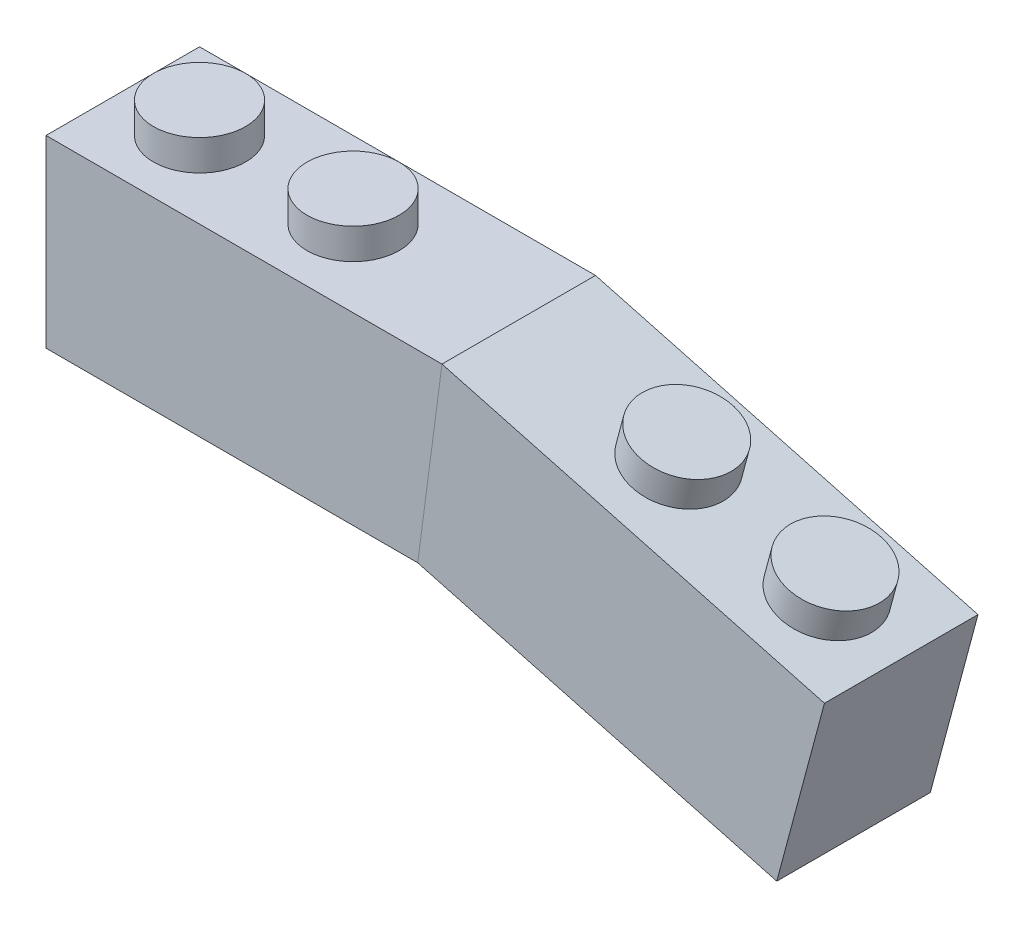
ISO-10303-21;
HEADER;
FILE_DESCRIPTION(('STEP AP214'),'2;1');
FILE_NAME('part.step','',(''),(''),'','','');
FILE_SCHEMA(('AUTOMOTIVE_DESIGN { 1 0 10303 214 1 1 1 1 }'));
ENDSEC;
DATA;
#1=APPLICATION_CONTEXT('core data for automotive mechanical design processes');
#2=APPLICATION_PROTOCOL_DEFINITION('international standard','automotive_design',2000,#1);
#3=PRODUCT_CONTEXT('',#1,'mechanical');
#4=PRODUCT('Part','Part','',(#3));
#5=PRODUCT_RELATED_PRODUCT_CATEGORY('part','',(#4));
#6=PRODUCT_DEFINITION_FORMATION('','',#4);
#7=PRODUCT_DEFINITION_CONTEXT('part definition',#1,'design');
#8=PRODUCT_DEFINITION('design','',#6,#7);
#9=PRODUCT_DEFINITION_SHAPE('','',#8);
#10=(LENGTH_UNIT() NAMED_UNIT(*) SI_UNIT(.MILLI.,.METRE.));
#11=(NAMED_UNIT(*) PLANE_ANGLE_UNIT() SI_UNIT($,.RADIAN.));
#12=(NAMED_UNIT(*) SI_UNIT($,.STERADIAN.) SOLID_ANGLE_UNIT());
#13=UNCERTAINTY_MEASURE_WITH_UNIT(LENGTH_MEASURE(1.E-05),#10,'distance_accuracy_value','');
#14=(GEOMETRIC_REPRESENTATION_CONTEXT(3) GLOBAL_UNCERTAINTY_ASSIGNED_CONTEXT((#13)) GLOBAL_UNIT_ASSIGNED_CONTEXT((#10,
#11,#12)) REPRESENTATION_CONTEXT('',''));
#15=CARTESIAN_POINT('',(0.,0.,0.));
#16=DIRECTION('',(0.,0.,1.));
#17=DIRECTION('',(1.,0.,0.));
#18=AXIS2_PLACEMENT_3D('',#15,#16,#17);
#19=CARTESIAN_POINT('',(39.3185165257814,-5.17638090205043,0.));
#20=DIRECTION('',(-0.965925826289068,0.258819045102521,0.));
#21=DIRECTION('',(0.,0.,1.));
#22=AXIS2_PLACEMENT_3D('',#19,#20,#21);
#23=PLANE('',#22);
#24=DIRECTION('',(0.258819045102521,0.965925826289068,0.));
#25=VECTOR('',#24,1.);
#26=CARTESIAN_POINT('',(38.0761851092893,-9.81282486823796,-4.));
#27=LINE('',#26,#25);
#28=CARTESIAN_POINT('',(38.0761851092893,-9.81282486823796,-4.));
#29=VERTEX_POINT('',#28);
#30=CARTESIAN_POINT('',(40.5608479422735,-0.539936935862903,-4.));
#31=VERTEX_POINT('',#30);
#32=EDGE_CURVE('E132',#29,#31,#27,.T.);
#33=ORIENTED_EDGE('',*,*,#32,.T.);
#34=DIRECTION('',(0.,0.,1.));
#35=VECTOR('',#34,1.);
#36=CARTESIAN_POINT('',(40.5608479422735,-0.539936935862902,4.));
#37=LINE('',#36,#35);
#38=CARTESIAN_POINT('',(40.5608479422735,-0.539936935862903,4.));
#39=VERTEX_POINT('',#38);
#40=EDGE_CURVE('E177',#31,#39,#37,.T.);
#41=ORIENTED_EDGE('',*,*,#40,.T.);
#42=DIRECTION('',(-0.258819045102521,-0.965925826289068,0.));
#43=VECTOR('',#42,1.);
#44=CARTESIAN_POINT('',(38.0761851092893,-9.81282486823796,4.));
#45=LINE('',#44,#43);
#46=CARTESIAN_POINT('',(38.0761851092893,-9.81282486823796,4.));
#47=VERTEX_POINT('',#46);
#48=EDGE_CURVE('E173',#39,#47,#45,.T.);
#49=ORIENTED_EDGE('',*,*,#48,.T.);
#50=DIRECTION('',(0.,0.,-1.));
#51=VECTOR('',#50,1.);
#52=CARTESIAN_POINT('',(38.0761851092893,-9.81282486823796,4.));
#53=LINE('',#52,#51);
#54=EDGE_CURVE('E86',#47,#29,#53,.T.);
#55=ORIENTED_EDGE('',*,*,#54,.T.);
#56=EDGE_LOOP('',(#33,#41,#49,#55));
#57=FACE_BOUND('',#56,.T.);
#58=ADVANCED_FACE('F41',(#57),#23,.F.);
#59=CARTESIAN_POINT('',(0.,0.,0.));
#60=DIRECTION('',(-1.,0.,0.));
#61=DIRECTION('',(0.,0.,1.));
#62=AXIS2_PLACEMENT_3D('',#59,#60,#61);
#63=PLANE('',#62);
#64=DIRECTION('',(0.,1.,0.));
#65=VECTOR('',#64,1.);
#66=CARTESIAN_POINT('',(0.,-4.8,-4.));
#67=LINE('',#66,#65);
#68=CARTESIAN_POINT('',(0.,-4.8,-4.));
#69=VERTEX_POINT('',#68);
#70=CARTESIAN_POINT('',(0.,4.8,-4.));
#71=VERTEX_POINT('',#70);
#72=EDGE_CURVE('E95',#69,#71,#67,.T.);
#73=ORIENTED_EDGE('',*,*,#72,.F.);
#74=DIRECTION('',(0.,0.,-1.));
#75=VECTOR('',#74,1.);
#76=CARTESIAN_POINT('',(0.,-4.8,4.));
#77=LINE('',#76,#75);
#78=CARTESIAN_POINT('',(0.,-4.8,4.));
#79=VERTEX_POINT('',#78);
#80=EDGE_CURVE('E147',#79,#69,#77,.T.);
#81=ORIENTED_EDGE('',*,*,#80,.F.);
#82=DIRECTION('',(0.,-1.,0.));
#83=VECTOR('',#82,1.);
#84=CARTESIAN_POINT('',(0.,-4.8,4.));
#85=LINE('',#84,#83);
#86=CARTESIAN_POINT('',(0.,4.8,4.));
#87=VERTEX_POINT('',#86);
#88=EDGE_CURVE('E154',#87,#79,#85,.T.);
#89=ORIENTED_EDGE('',*,*,#88,.F.);
#90=DIRECTION('',(0.,0.,1.));
#91=VECTOR('',#90,1.);
#92=CARTESIAN_POINT('',(0.,4.8,4.));
#93=LINE('',#92,#91);
#94=EDGE_CURVE('E158',#71,#87,#93,.T.);
#95=ORIENTED_EDGE('',*,*,#94,.F.);
#96=EDGE_LOOP('',(#73,#81,#89,#95));
#97=FACE_BOUND('',#96,.T.);
#98=ADVANCED_FACE('F387',(#97),#63,.T.);
#99=CARTESIAN_POINT('',(17.9896366299991,-4.43065042448355,-4.));
#100=DIRECTION('',(0.,0.,-1.));
#101=DIRECTION('',(-1.,0.,0.));
#102=AXIS2_PLACEMENT_3D('',#99,#100,#101);
#103=PLANE('',#102);
#104=DIRECTION('',(-0.130526192220052,-0.99144486137381,0.));
#105=VECTOR('',#104,1.);
#106=CARTESIAN_POINT('',(19.0380925546446,-7.30641243411898,-4.));
#107=LINE('',#106,#105);
#108=CARTESIAN_POINT('',(20.6319319884195,4.8,-4.));
#109=VERTEX_POINT('',#108);
#110=CARTESIAN_POINT('',(19.3680680115805,-4.8,-4.));
#111=VERTEX_POINT('',#110);
#112=EDGE_CURVE('E131',#109,#111,#107,.T.);
#113=ORIENTED_EDGE('',*,*,#112,.F.);
#114=DIRECTION('',(0.965925826289068,-0.258819045102521,0.));
#115=VECTOR('',#114,1.);
#116=CARTESIAN_POINT('',(20.4742994629833,4.8422375078915,-4.));
#117=LINE('',#116,#115);
#118=EDGE_CURVE('E134',#109,#31,#117,.T.);
#119=ORIENTED_EDGE('',*,*,#118,.T.);
#120=ORIENTED_EDGE('',*,*,#32,.F.);
#121=DIRECTION('',(0.965925826289068,-0.258819045102521,0.));
#122=VECTOR('',#121,1.);
#123=CARTESIAN_POINT('',(17.9896366299991,-4.43065042448355,-4.));
#124=LINE('',#123,#122);
#125=EDGE_CURVE('E44',#111,#29,#124,.T.);
#126=ORIENTED_EDGE('',*,*,#125,.F.);
#127=EDGE_LOOP('',(#113,#119,#120,#126));
#128=FACE_BOUND('',#127,.T.);
#129=ADVANCED_FACE('F129',(#128),#103,.T.);
#130=CARTESIAN_POINT('',(20.4742994629833,4.8422375078915,4.));
#131=DIRECTION('',(0.258819045102521,0.965925826289068,0.));
#132=DIRECTION('',(-0.965925826289068,0.258819045102521,0.));
#133=AXIS2_PLACEMENT_3D('',#130,#131,#132);
#134=PLANE('',#133);
#135=CARTESIAN_POINT('',(28.9697380268046,2.56589160536736,0.));
#136=DIRECTION('',(0.258819045102521,0.965925826289068,0.));
#137=DIRECTION('',(-0.965925826289068,0.258819045102521,0.));
#138=AXIS2_PLACEMENT_3D('',#135,#136,#137);
#139=CIRCLE('',#138,2.4);
#140=CARTESIAN_POINT('',(26.6515160437109,3.18705731361341,0.));
#141=VERTEX_POINT('',#140);
#142=EDGE_CURVE('E228',#141,#141,#139,.T.);
#143=ORIENTED_EDGE('',*,*,#142,.F.);
#144=EDGE_LOOP('',(#143));
#145=FACE_BOUND('',#144,.T.);
#146=CARTESIAN_POINT('',(36.6971446371172,0.495339244547189,0.));
#147=DIRECTION('',(0.258819045102521,0.965925826289068,0.));
#148=DIRECTION('',(-0.965925826289068,0.258819045102521,0.));
#149=AXIS2_PLACEMENT_3D('',#146,#147,#148);
#150=CIRCLE('',#149,2.4);
#151=CARTESIAN_POINT('',(34.3789226540234,1.11650495279324,0.));
#152=VERTEX_POINT('',#151);
#153=EDGE_CURVE('E220',#152,#152,#150,.T.);
#154=ORIENTED_EDGE('',*,*,#153,.F.);
#155=EDGE_LOOP('',(#154));
#156=FACE_BOUND('',#155,.T.);
#157=DIRECTION('',(0.,0.,-1.));
#158=VECTOR('',#157,1.);
#159=CARTESIAN_POINT('',(20.6319319884195,4.8,4.));
#160=LINE('',#159,#158);
#161=CARTESIAN_POINT('',(20.6319319884195,4.8,4.));
#162=VERTEX_POINT('',#161);
#163=EDGE_CURVE('E11',#162,#109,#160,.T.);
#164=ORIENTED_EDGE('',*,*,#163,.F.);
#165=DIRECTION('',(0.965925826289068,-0.258819045102521,0.));
#166=VECTOR('',#165,1.);
#167=CARTESIAN_POINT('',(20.4742994629833,4.8422375078915,4.));
#168=LINE('',#167,#166);
#169=EDGE_CURVE('E186',#162,#39,#168,.T.);
#170=ORIENTED_EDGE('',*,*,#169,.T.);
#171=ORIENTED_EDGE('',*,*,#40,.F.);
#172=ORIENTED_EDGE('',*,*,#118,.F.);
#173=EDGE_LOOP('',(#164,#170,#171,#172));
#174=FACE_BOUND('',#173,.T.);
#175=ADVANCED_FACE('F190',(#145,#156,#174),#134,.T.);
#176=CARTESIAN_POINT('',(17.9896366299991,-4.43065042448355,4.));
#177=DIRECTION('',(0.,0.,1.));
#178=DIRECTION('',(1.,0.,0.));
#179=AXIS2_PLACEMENT_3D('',#176,#177,#178);
#180=PLANE('',#179);
#181=DIRECTION('',(0.130526192220052,0.99144486137381,0.));
#182=VECTOR('',#181,1.);
#183=CARTESIAN_POINT('',(19.0380925546446,-7.30641243411898,4.));
#184=LINE('',#183,#182);
#185=CARTESIAN_POINT('',(19.3680680115805,-4.8,4.));
#186=VERTEX_POINT('',#185);
#187=EDGE_CURVE('E50',#186,#162,#184,.T.);
#188=ORIENTED_EDGE('',*,*,#187,.F.);
#189=DIRECTION('',(0.965925826289068,-0.258819045102521,0.));
#190=VECTOR('',#189,1.);
#191=CARTESIAN_POINT('',(17.9896366299991,-4.43065042448355,4.));
#192=LINE('',#191,#190);
#193=EDGE_CURVE('E182',#186,#47,#192,.T.);
#194=ORIENTED_EDGE('',*,*,#193,.T.);
#195=ORIENTED_EDGE('',*,*,#48,.F.);
#196=ORIENTED_EDGE('',*,*,#169,.F.);
#197=EDGE_LOOP('',(#188,#194,#195,#196));
#198=FACE_BOUND('',#197,.T.);
#199=ADVANCED_FACE('F385',(#198),#180,.T.);
#200=CARTESIAN_POINT('',(17.9896366299991,-4.43065042448355,4.));
#201=DIRECTION('',(-0.258819045102521,-0.965925826289068,0.));
#202=DIRECTION('',(0.965925826289068,-0.258819045102521,0.));
#203=AXIS2_PLACEMENT_3D('',#200,#201,#202);
#204=PLANE('',#203);
#205=DIRECTION('',(0.965925826289068,-0.258819045102521,0.));
#206=VECTOR('',#205,1.);
#207=CARTESIAN_POINT('',(17.9896366299991,-4.43065042448355,-2.4));
#208=LINE('',#207,#206);
#209=CARTESIAN_POINT('',(19.3680680115805,-4.8,-2.4));
#210=VERTEX_POINT('',#209);
#211=CARTESIAN_POINT('',(36.5307037872267,-9.39871439607392,-2.4));
#212=VERTEX_POINT('',#211);
#213=EDGE_CURVE('E120',#210,#212,#208,.T.);
#214=ORIENTED_EDGE('',*,*,#213,.F.);
#215=DIRECTION('',(0.,0.,1.));
#216=VECTOR('',#215,1.);
#217=CARTESIAN_POINT('',(19.3680680115805,-4.8,4.));
#218=LINE('',#217,#216);
#219=EDGE_CURVE('E114',#111,#210,#218,.T.);
#220=ORIENTED_EDGE('',*,*,#219,.F.);
#221=ORIENTED_EDGE('',*,*,#125,.T.);
#222=ORIENTED_EDGE('',*,*,#54,.F.);
#223=ORIENTED_EDGE('',*,*,#193,.F.);
#224=CARTESIAN_POINT('',(19.3680680115805,-4.8,2.4));
#225=VERTEX_POINT('',#224);
#226=EDGE_CURVE('E125',#225,#186,#218,.T.);
#227=ORIENTED_EDGE('',*,*,#226,.F.);
#228=DIRECTION('',(0.965925826289068,-0.258819045102521,0.));
#229=VECTOR('',#228,1.);
#230=CARTESIAN_POINT('',(17.9896366299991,-4.43065042448355,2.4));
#231=LINE('',#230,#229);
#232=CARTESIAN_POINT('',(36.5307037872267,-9.39871439607392,2.4));
#233=VERTEX_POINT('',#232);
#234=EDGE_CURVE('E254',#225,#233,#231,.T.);
#235=ORIENTED_EDGE('',*,*,#234,.T.);
#236=DIRECTION('',(0.,0.,-1.));
#237=VECTOR('',#236,1.);
#238=CARTESIAN_POINT('',(36.5307037872268,-9.39871439607392,4.));
#239=LINE('',#238,#237);
#240=EDGE_CURVE('E260',#233,#212,#239,.T.);
#241=ORIENTED_EDGE('',*,*,#240,.T.);
#242=EDGE_LOOP('',(#214,#220,#221,#222,#223,#227,#235,#241));
#243=FACE_BOUND('',#242,.T.);
#244=ADVANCED_FACE('F116',(#243),#204,.T.);
#245=CARTESIAN_POINT('',(0.,-4.8,4.));
#246=DIRECTION('',(0.,-1.,0.));
#247=DIRECTION('',(0.,0.,-1.));
#248=AXIS2_PLACEMENT_3D('',#245,#246,#247);
#249=PLANE('',#248);
#250=DIRECTION('',(1.,0.,0.));
#251=VECTOR('',#250,1.);
#252=CARTESIAN_POINT('',(0.,-4.8,-2.4));
#253=LINE('',#252,#251);
#254=CARTESIAN_POINT('',(1.6,-4.8,-2.4));
#255=VERTEX_POINT('',#254);
#256=EDGE_CURVE('E240',#255,#210,#253,.T.);
#257=ORIENTED_EDGE('',*,*,#256,.F.);
#258=DIRECTION('',(0.,0.,-1.));
#259=VECTOR('',#258,1.);
#260=CARTESIAN_POINT('',(1.6,-4.8,4.));
#261=LINE('',#260,#259);
#262=CARTESIAN_POINT('',(1.6,-4.8,2.4));
#263=VERTEX_POINT('',#262);
#264=EDGE_CURVE('E245',#263,#255,#261,.T.);
#265=ORIENTED_EDGE('',*,*,#264,.F.);
#266=DIRECTION('',(1.,0.,0.));
#267=VECTOR('',#266,1.);
#268=CARTESIAN_POINT('',(0.,-4.8,2.4));
#269=LINE('',#268,#267);
#270=EDGE_CURVE('E58',#263,#225,#269,.T.);
#271=ORIENTED_EDGE('',*,*,#270,.T.);
#272=ORIENTED_EDGE('',*,*,#226,.T.);
#273=DIRECTION('',(1.,0.,0.));
#274=VECTOR('',#273,1.);
#275=CARTESIAN_POINT('',(0.,-4.8,4.));
#276=LINE('',#275,#274);
#277=EDGE_CURVE('E143',#79,#186,#276,.T.);
#278=ORIENTED_EDGE('',*,*,#277,.F.);
#279=ORIENTED_EDGE('',*,*,#80,.T.);
#280=DIRECTION('',(1.,0.,0.));
#281=VECTOR('',#280,1.);
#282=CARTESIAN_POINT('',(0.,-4.8,-4.));
#283=LINE('',#282,#281);
#284=EDGE_CURVE('E139',#69,#111,#283,.T.);
#285=ORIENTED_EDGE('',*,*,#284,.T.);
#286=ORIENTED_EDGE('',*,*,#219,.T.);
#287=EDGE_LOOP('',(#257,#265,#271,#272,#278,#279,#285,#286));
#288=FACE_BOUND('',#287,.T.);
#289=ADVANCED_FACE('F145',(#288),#249,.T.);
#290=CARTESIAN_POINT('',(0.,-4.8,4.));
#291=DIRECTION('',(0.,0.,1.));
#292=DIRECTION('',(1.,0.,0.));
#293=AXIS2_PLACEMENT_3D('',#290,#291,#292);
#294=PLANE('',#293);
#295=ORIENTED_EDGE('',*,*,#277,.T.);
#296=ORIENTED_EDGE('',*,*,#187,.T.);
#297=DIRECTION('',(1.,0.,0.));
#298=VECTOR('',#297,1.);
#299=CARTESIAN_POINT('',(0.,4.8,4.));
#300=LINE('',#299,#298);
#301=EDGE_CURVE('E152',#87,#162,#300,.T.);
#302=ORIENTED_EDGE('',*,*,#301,.F.);
#303=ORIENTED_EDGE('',*,*,#88,.T.);
#304=EDGE_LOOP('',(#295,#296,#302,#303));
#305=FACE_BOUND('',#304,.T.);
#306=ADVANCED_FACE('F196',(#305),#294,.T.);
#307=CARTESIAN_POINT('',(0.,4.8,4.));
#308=DIRECTION('',(0.,1.,0.));
#309=DIRECTION('',(0.,0.,1.));
#310=AXIS2_PLACEMENT_3D('',#307,#308,#309);
#311=PLANE('',#310);
#312=CARTESIAN_POINT('',(12.,4.8,0.));
#313=DIRECTION('',(0.,1.,0.));
#314=DIRECTION('',(0.,0.,1.));
#315=AXIS2_PLACEMENT_3D('',#312,#313,#314);
#316=CIRCLE('',#315,2.4);
#317=CARTESIAN_POINT('',(12.,4.8,2.4));
#318=VERTEX_POINT('',#317);
#319=EDGE_CURVE('E212',#318,#318,#316,.T.);
#320=ORIENTED_EDGE('',*,*,#319,.F.);
#321=EDGE_LOOP('',(#320));
#322=FACE_BOUND('',#321,.T.);
#323=CARTESIAN_POINT('',(4.,4.8,0.));
#324=DIRECTION('',(0.,1.,0.));
#325=DIRECTION('',(0.,0.,1.));
#326=AXIS2_PLACEMENT_3D('',#323,#324,#325);
#327=CIRCLE('',#326,2.4);
#328=CARTESIAN_POINT('',(4.,4.8,2.4));
#329=VERTEX_POINT('',#328);
#330=EDGE_CURVE('E204',#329,#329,#327,.T.);
#331=ORIENTED_EDGE('',*,*,#330,.F.);
#332=EDGE_LOOP('',(#331));
#333=FACE_BOUND('',#332,.T.);
#334=ORIENTED_EDGE('',*,*,#301,.T.);
#335=ORIENTED_EDGE('',*,*,#163,.T.);
#336=DIRECTION('',(1.,0.,0.));
#337=VECTOR('',#336,1.);
#338=CARTESIAN_POINT('',(0.,4.8,-4.));
#339=LINE('',#338,#337);
#340=EDGE_CURVE('E141',#71,#109,#339,.T.);
#341=ORIENTED_EDGE('',*,*,#340,.F.);
#342=ORIENTED_EDGE('',*,*,#94,.T.);
#343=EDGE_LOOP('',(#334,#335,#341,#342));
#344=FACE_BOUND('',#343,.T.);
#345=ADVANCED_FACE('F192',(#322,#333,#344),#311,.T.);
#346=CARTESIAN_POINT('',(0.,-4.8,-4.));
#347=DIRECTION('',(0.,0.,-1.));
#348=DIRECTION('',(-1.,0.,0.));
#349=AXIS2_PLACEMENT_3D('',#346,#347,#348);
#350=PLANE('',#349);
#351=ORIENTED_EDGE('',*,*,#340,.T.);
#352=ORIENTED_EDGE('',*,*,#112,.T.);
#353=ORIENTED_EDGE('',*,*,#284,.F.);
#354=ORIENTED_EDGE('',*,*,#72,.T.);
#355=EDGE_LOOP('',(#351,#352,#353,#354));
#356=FACE_BOUND('',#355,.T.);
#357=ADVANCED_FACE('F138',(#356),#350,.T.);
#358=CARTESIAN_POINT('',(4.,6.4,0.));
#359=DIRECTION('',(0.,-1.,0.));
#360=DIRECTION('',(0.,0.,-1.));
#361=AXIS2_PLACEMENT_3D('',#358,#359,#360);
#362=CYLINDRICAL_SURFACE('',#361,2.4);
#363=CARTESIAN_POINT('',(4.,6.4,0.));
#364=DIRECTION('',(0.,1.,0.));
#365=DIRECTION('',(0.,0.,1.));
#366=AXIS2_PLACEMENT_3D('',#363,#364,#365);
#367=CIRCLE('',#366,2.4);
#368=CARTESIAN_POINT('',(4.,6.4,2.4));
#369=VERTEX_POINT('',#368);
#370=EDGE_CURVE('E174',#369,#369,#367,.T.);
#371=ORIENTED_EDGE('',*,*,#370,.F.);
#372=EDGE_LOOP('',(#371));
#373=FACE_BOUND('',#372,.T.);
#374=ORIENTED_EDGE('',*,*,#330,.T.);
#375=EDGE_LOOP('',(#374));
#376=FACE_BOUND('',#375,.T.);
#377=ADVANCED_FACE('F388',(#373,#376),#362,.T.);
#378=CARTESIAN_POINT('',(4.,6.4,0.));
#379=DIRECTION('',(0.,1.,0.));
#380=DIRECTION('',(0.,0.,1.));
#381=AXIS2_PLACEMENT_3D('',#378,#379,#380);
#382=PLANE('',#381);
#383=ORIENTED_EDGE('',*,*,#370,.T.);
#384=EDGE_LOOP('',(#383));
#385=FACE_BOUND('',#384,.T.);
#386=ADVANCED_FACE('F393',(#385),#382,.T.);
#387=CARTESIAN_POINT('',(12.,6.4,0.));
#388=DIRECTION('',(0.,-1.,0.));
#389=DIRECTION('',(0.,0.,-1.));
#390=AXIS2_PLACEMENT_3D('',#387,#388,#389);
#391=CYLINDRICAL_SURFACE('',#390,2.4);
#392=CARTESIAN_POINT('',(12.,6.4,0.));
#393=DIRECTION('',(0.,1.,0.));
#394=DIRECTION('',(0.,0.,1.));
#395=AXIS2_PLACEMENT_3D('',#392,#393,#394);
#396=CIRCLE('',#395,2.4);
#397=CARTESIAN_POINT('',(12.,6.4,2.4));
#398=VERTEX_POINT('',#397);
#399=EDGE_CURVE('E208',#398,#398,#396,.T.);
#400=ORIENTED_EDGE('',*,*,#399,.F.);
#401=EDGE_LOOP('',(#400));
#402=FACE_BOUND('',#401,.T.);
#403=ORIENTED_EDGE('',*,*,#319,.T.);
#404=EDGE_LOOP('',(#403));
#405=FACE_BOUND('',#404,.T.);
#406=ADVANCED_FACE('F446',(#402,#405),#391,.T.);
#407=CARTESIAN_POINT('',(12.,6.4,0.));
#408=DIRECTION('',(0.,1.,0.));
#409=DIRECTION('',(0.,0.,1.));
#410=AXIS2_PLACEMENT_3D('',#407,#408,#409);
#411=PLANE('',#410);
#412=ORIENTED_EDGE('',*,*,#399,.T.);
#413=EDGE_LOOP('',(#412));
#414=FACE_BOUND('',#413,.T.);
#415=ADVANCED_FACE('F451',(#414),#411,.T.);
#416=CARTESIAN_POINT('',(37.1112551092812,2.0408205666097,0.));
#417=DIRECTION('',(-0.258819045102521,-0.965925826289068,0.));
#418=DIRECTION('',(0.965925826289068,-0.258819045102521,0.));
#419=AXIS2_PLACEMENT_3D('',#416,#417,#418);
#420=CYLINDRICAL_SURFACE('',#419,2.4);
#421=CARTESIAN_POINT('',(37.1112551092812,2.0408205666097,0.));
#422=DIRECTION('',(0.258819045102521,0.965925826289068,0.));
#423=DIRECTION('',(-0.965925826289068,0.258819045102521,0.));
#424=AXIS2_PLACEMENT_3D('',#421,#422,#423);
#425=CIRCLE('',#424,2.4);
#426=CARTESIAN_POINT('',(34.7930331261875,2.66198627485575,0.));
#427=VERTEX_POINT('',#426);
#428=EDGE_CURVE('E216',#427,#427,#425,.T.);
#429=ORIENTED_EDGE('',*,*,#428,.F.);
#430=EDGE_LOOP('',(#429));
#431=FACE_BOUND('',#430,.T.);
#432=ORIENTED_EDGE('',*,*,#153,.T.);
#433=EDGE_LOOP('',(#432));
#434=FACE_BOUND('',#433,.T.);
#435=ADVANCED_FACE('F461',(#431,#434),#420,.T.);
#436=CARTESIAN_POINT('',(37.1112551092812,2.0408205666097,0.));
#437=DIRECTION('',(0.258819045102521,0.965925826289068,0.));
#438=DIRECTION('',(-0.965925826289068,0.258819045102521,0.));
#439=AXIS2_PLACEMENT_3D('',#436,#437,#438);
#440=PLANE('',#439);
#441=ORIENTED_EDGE('',*,*,#428,.T.);
#442=EDGE_LOOP('',(#441));
#443=FACE_BOUND('',#442,.T.);
#444=ADVANCED_FACE('F471',(#443),#440,.T.);
#445=CARTESIAN_POINT('',(29.3838484989687,4.11137292742987,0.));
#446=DIRECTION('',(-0.258819045102521,-0.965925826289068,0.));
#447=DIRECTION('',(0.965925826289068,-0.258819045102521,0.));
#448=AXIS2_PLACEMENT_3D('',#445,#446,#447);
#449=CYLINDRICAL_SURFACE('',#448,2.4);
#450=CARTESIAN_POINT('',(29.3838484989687,4.11137292742987,0.));
#451=DIRECTION('',(0.258819045102521,0.965925826289068,0.));
#452=DIRECTION('',(-0.965925826289068,0.258819045102521,0.));
#453=AXIS2_PLACEMENT_3D('',#450,#451,#452);
#454=CIRCLE('',#453,2.4);
#455=CARTESIAN_POINT('',(27.0656265158749,4.73253863567592,0.));
#456=VERTEX_POINT('',#455);
#457=EDGE_CURVE('E224',#456,#456,#454,.T.);
#458=ORIENTED_EDGE('',*,*,#457,.F.);
#459=EDGE_LOOP('',(#458));
#460=FACE_BOUND('',#459,.T.);
#461=ORIENTED_EDGE('',*,*,#142,.T.);
#462=EDGE_LOOP('',(#461));
#463=FACE_BOUND('',#462,.T.);
#464=ADVANCED_FACE('F481',(#460,#463),#449,.T.);
#465=CARTESIAN_POINT('',(29.3838484989687,4.11137292742987,0.));
#466=DIRECTION('',(0.258819045102521,0.965925826289068,0.));
#467=DIRECTION('',(-0.965925826289068,0.258819045102521,0.));
#468=AXIS2_PLACEMENT_3D('',#465,#466,#467);
#469=PLANE('',#468);
#470=ORIENTED_EDGE('',*,*,#457,.T.);
#471=EDGE_LOOP('',(#470));
#472=FACE_BOUND('',#471,.T.);
#473=ADVANCED_FACE('F499',(#472),#469,.T.);
#474=CARTESIAN_POINT('',(37.7730352037188,-4.76227042988639,0.));
#475=DIRECTION('',(-0.965925826289068,0.258819045102521,0.));
#476=DIRECTION('',(0.,0.,1.));
#477=AXIS2_PLACEMENT_3D('',#474,#475,#476);
#478=PLANE('',#477);
#479=DIRECTION('',(0.258819045102521,0.965925826289068,0.));
#480=VECTOR('',#479,1.);
#481=CARTESIAN_POINT('',(36.5307037872267,-9.39871439607392,-2.4));
#482=LINE('',#481,#480);
#483=CARTESIAN_POINT('',(38.6012561480469,-1.67130778576138,-2.4));
#484=VERTEX_POINT('',#483);
#485=EDGE_CURVE('E259',#212,#484,#482,.T.);
#486=ORIENTED_EDGE('',*,*,#485,.F.);
#487=ORIENTED_EDGE('',*,*,#240,.F.);
#488=DIRECTION('',(-0.258819045102521,-0.965925826289068,0.));
#489=VECTOR('',#488,1.);
#490=CARTESIAN_POINT('',(36.5307037872267,-9.39871439607392,2.4));
#491=LINE('',#490,#489);
#492=CARTESIAN_POINT('',(38.6012561480469,-1.67130778576138,2.4));
#493=VERTEX_POINT('',#492);
#494=EDGE_CURVE('E263',#493,#233,#491,.T.);
#495=ORIENTED_EDGE('',*,*,#494,.F.);
#496=DIRECTION('',(0.,0.,1.));
#497=VECTOR('',#496,1.);
#498=CARTESIAN_POINT('',(38.6012561480469,-1.67130778576138,4.));
#499=LINE('',#498,#497);
#500=EDGE_CURVE('E330',#484,#493,#499,.T.);
#501=ORIENTED_EDGE('',*,*,#500,.F.);
#502=EDGE_LOOP('',(#486,#487,#495,#501));
#503=FACE_BOUND('',#502,.T.);
#504=ADVANCED_FACE('F348',(#503),#478,.T.);
#505=CARTESIAN_POINT('',(1.6,0.,0.));
#506=DIRECTION('',(-1.,0.,0.));
#507=DIRECTION('',(0.,0.,1.));
#508=AXIS2_PLACEMENT_3D('',#505,#506,#507);
#509=PLANE('',#508);
#510=DIRECTION('',(0.,1.,0.));
#511=VECTOR('',#510,1.);
#512=CARTESIAN_POINT('',(1.6,-4.8,-2.4));
#513=LINE('',#512,#511);
#514=CARTESIAN_POINT('',(1.6,3.2,-2.4));
#515=VERTEX_POINT('',#514);
#516=EDGE_CURVE('E238',#255,#515,#513,.T.);
#517=ORIENTED_EDGE('',*,*,#516,.T.);
#518=DIRECTION('',(0.,0.,1.));
#519=VECTOR('',#518,1.);
#520=CARTESIAN_POINT('',(1.6,3.2,4.));
#521=LINE('',#520,#519);
#522=CARTESIAN_POINT('',(1.6,3.2,2.4));
#523=VERTEX_POINT('',#522);
#524=EDGE_CURVE('E293',#515,#523,#521,.T.);
#525=ORIENTED_EDGE('',*,*,#524,.T.);
#526=DIRECTION('',(0.,-1.,0.));
#527=VECTOR('',#526,1.);
#528=CARTESIAN_POINT('',(1.6,-4.8,2.4));
#529=LINE('',#528,#527);
#530=EDGE_CURVE('E249',#523,#263,#529,.T.);
#531=ORIENTED_EDGE('',*,*,#530,.T.);
#532=ORIENTED_EDGE('',*,*,#264,.T.);
#533=EDGE_LOOP('',(#517,#525,#531,#532));
#534=FACE_BOUND('',#533,.T.);
#535=ADVANCED_FACE('F377',(#534),#509,.F.);
#536=CARTESIAN_POINT('',(17.9896366299991,-4.43065042448355,-2.4));
#537=DIRECTION('',(0.,0.,-1.));
#538=DIRECTION('',(-1.,0.,0.));
#539=AXIS2_PLACEMENT_3D('',#536,#537,#538);
#540=PLANE('',#539);
#541=DIRECTION('',(-0.130526192220052,-0.99144486137381,0.));
#542=VECTOR('',#541,1.);
#543=CARTESIAN_POINT('',(19.0380925546446,-7.30641243411898,-2.4));
#544=LINE('',#543,#542);
#545=CARTESIAN_POINT('',(20.4212879922797,3.2,-2.4));
#546=VERTEX_POINT('',#545);
#547=EDGE_CURVE('E252',#546,#210,#544,.T.);
#548=ORIENTED_EDGE('',*,*,#547,.T.);
#549=ORIENTED_EDGE('',*,*,#213,.T.);
#550=ORIENTED_EDGE('',*,*,#485,.T.);
#551=DIRECTION('',(0.965925826289068,-0.258819045102521,0.));
#552=VECTOR('',#551,1.);
#553=CARTESIAN_POINT('',(20.0601889908193,3.29675618582899,-2.4));
#554=LINE('',#553,#552);
#555=EDGE_CURVE('E239',#546,#484,#554,.T.);
#556=ORIENTED_EDGE('',*,*,#555,.F.);
#557=EDGE_LOOP('',(#548,#549,#550,#556));
#558=FACE_BOUND('',#557,.T.);
#559=ADVANCED_FACE('F341',(#558),#540,.F.);
#560=CARTESIAN_POINT('',(20.0601889908193,3.29675618582899,4.));
#561=DIRECTION('',(0.258819045102521,0.965925826289068,0.));
#562=DIRECTION('',(-0.965925826289068,0.258819045102521,0.));
#563=AXIS2_PLACEMENT_3D('',#560,#561,#562);
#564=PLANE('',#563);
#565=CARTESIAN_POINT('',(28.5556275546406,1.02041028330485,0.));
#566=DIRECTION('',(0.258819045102521,0.965925826289068,0.));
#567=DIRECTION('',(-0.965925826289068,0.258819045102521,0.));
#568=AXIS2_PLACEMENT_3D('',#565,#566,#567);
#569=CIRCLE('',#568,0.799999999999998);
#570=CARTESIAN_POINT('',(27.7828868936094,1.22746551938686,0.));
#571=VERTEX_POINT('',#570);
#572=EDGE_CURVE('E270',#571,#571,#569,.T.);
#573=ORIENTED_EDGE('',*,*,#572,.T.);
#574=EDGE_LOOP('',(#573));
#575=FACE_BOUND('',#574,.T.);
#576=CARTESIAN_POINT('',(36.2830341649532,-1.05014207751532,0.));
#577=DIRECTION('',(0.258819045102521,0.965925826289068,0.));
#578=DIRECTION('',(-0.965925826289068,0.258819045102521,0.));
#579=AXIS2_PLACEMENT_3D('',#576,#577,#578);
#580=CIRCLE('',#579,0.799999999999998);
#581=CARTESIAN_POINT('',(35.5102935039219,-0.843086841433306,0.));
#582=VERTEX_POINT('',#581);
#583=EDGE_CURVE('E269',#582,#582,#580,.T.);
#584=ORIENTED_EDGE('',*,*,#583,.T.);
#585=EDGE_LOOP('',(#584));
#586=FACE_BOUND('',#585,.T.);
#587=DIRECTION('',(0.,0.,-1.));
#588=VECTOR('',#587,1.);
#589=CARTESIAN_POINT('',(20.4212879922797,3.2,4.));
#590=LINE('',#589,#588);
#591=CARTESIAN_POINT('',(20.4212879922797,3.2,2.4));
#592=VERTEX_POINT('',#591);
#593=EDGE_CURVE('E232',#592,#546,#590,.T.);
#594=ORIENTED_EDGE('',*,*,#593,.T.);
#595=ORIENTED_EDGE('',*,*,#555,.T.);
#596=ORIENTED_EDGE('',*,*,#500,.T.);
#597=DIRECTION('',(0.965925826289068,-0.258819045102521,0.));
#598=VECTOR('',#597,1.);
#599=CARTESIAN_POINT('',(20.0601889908193,3.29675618582899,2.4));
#600=LINE('',#599,#598);
#601=EDGE_CURVE('E258',#592,#493,#600,.T.);
#602=ORIENTED_EDGE('',*,*,#601,.F.);
#603=EDGE_LOOP('',(#594,#595,#596,#602));
#604=FACE_BOUND('',#603,.T.);
#605=ADVANCED_FACE('F351',(#575,#586,#604),#564,.F.);
#606=CARTESIAN_POINT('',(17.9896366299991,-4.43065042448355,2.4));
#607=DIRECTION('',(0.,0.,1.));
#608=DIRECTION('',(1.,0.,0.));
#609=AXIS2_PLACEMENT_3D('',#606,#607,#608);
#610=PLANE('',#609);
#611=DIRECTION('',(0.130526192220052,0.99144486137381,0.));
#612=VECTOR('',#611,1.);
#613=CARTESIAN_POINT('',(19.0380925546446,-7.30641243411898,2.4));
#614=LINE('',#613,#612);
#615=EDGE_CURVE('E305',#225,#592,#614,.T.);
#616=ORIENTED_EDGE('',*,*,#615,.T.);
#617=ORIENTED_EDGE('',*,*,#601,.T.);
#618=ORIENTED_EDGE('',*,*,#494,.T.);
#619=ORIENTED_EDGE('',*,*,#234,.F.);
#620=EDGE_LOOP('',(#616,#617,#618,#619));
#621=FACE_BOUND('',#620,.T.);
#622=ADVANCED_FACE('F382',(#621),#610,.F.);
#623=CARTESIAN_POINT('',(0.,-4.8,2.4));
#624=DIRECTION('',(0.,0.,1.));
#625=DIRECTION('',(1.,0.,0.));
#626=AXIS2_PLACEMENT_3D('',#623,#624,#625);
#627=PLANE('',#626);
#628=ORIENTED_EDGE('',*,*,#270,.F.);
#629=ORIENTED_EDGE('',*,*,#530,.F.);
#630=DIRECTION('',(1.,0.,0.));
#631=VECTOR('',#630,1.);
#632=CARTESIAN_POINT('',(0.,3.2,2.4));
#633=LINE('',#632,#631);
#634=EDGE_CURVE('E253',#523,#592,#633,.T.);
#635=ORIENTED_EDGE('',*,*,#634,.T.);
#636=ORIENTED_EDGE('',*,*,#615,.F.);
#637=EDGE_LOOP('',(#628,#629,#635,#636));
#638=FACE_BOUND('',#637,.T.);
#639=ADVANCED_FACE('F378',(#638),#627,.F.);
#640=CARTESIAN_POINT('',(0.,3.2,4.));
#641=DIRECTION('',(0.,1.,0.));
#642=DIRECTION('',(0.,0.,1.));
#643=AXIS2_PLACEMENT_3D('',#640,#641,#642);
#644=PLANE('',#643);
#645=CARTESIAN_POINT('',(12.,3.2,0.));
#646=DIRECTION('',(0.,1.,0.));
#647=DIRECTION('',(0.,0.,1.));
#648=AXIS2_PLACEMENT_3D('',#645,#646,#647);
#649=CIRCLE('',#648,0.799999999999999);
#650=CARTESIAN_POINT('',(12.,3.2,0.799999999999999));
#651=VERTEX_POINT('',#650);
#652=EDGE_CURVE('E275',#651,#651,#649,.T.);
#653=ORIENTED_EDGE('',*,*,#652,.T.);
#654=EDGE_LOOP('',(#653));
#655=FACE_BOUND('',#654,.T.);
#656=CARTESIAN_POINT('',(4.,3.2,0.));
#657=DIRECTION('',(0.,1.,0.));
#658=DIRECTION('',(0.,0.,1.));
#659=AXIS2_PLACEMENT_3D('',#656,#657,#658);
#660=CIRCLE('',#659,0.799999999999999);
#661=CARTESIAN_POINT('',(4.,3.2,0.799999999999999));
#662=VERTEX_POINT('',#661);
#663=EDGE_CURVE('E280',#662,#662,#660,.T.);
#664=ORIENTED_EDGE('',*,*,#663,.T.);
#665=EDGE_LOOP('',(#664));
#666=FACE_BOUND('',#665,.T.);
#667=ORIENTED_EDGE('',*,*,#634,.F.);
#668=ORIENTED_EDGE('',*,*,#524,.F.);
#669=DIRECTION('',(1.,0.,0.));
#670=VECTOR('',#669,1.);
#671=CARTESIAN_POINT('',(0.,3.2,-2.4));
#672=LINE('',#671,#670);
#673=EDGE_CURVE('E244',#515,#546,#672,.T.);
#674=ORIENTED_EDGE('',*,*,#673,.T.);
#675=ORIENTED_EDGE('',*,*,#593,.F.);
#676=EDGE_LOOP('',(#667,#668,#674,#675));
#677=FACE_BOUND('',#676,.T.);
#678=ADVANCED_FACE('F360',(#655,#666,#677),#644,.F.);
#679=CARTESIAN_POINT('',(0.,-4.8,-2.4));
#680=DIRECTION('',(0.,0.,-1.));
#681=DIRECTION('',(-1.,0.,0.));
#682=AXIS2_PLACEMENT_3D('',#679,#680,#681);
#683=PLANE('',#682);
#684=ORIENTED_EDGE('',*,*,#673,.F.);
#685=ORIENTED_EDGE('',*,*,#516,.F.);
#686=ORIENTED_EDGE('',*,*,#256,.T.);
#687=ORIENTED_EDGE('',*,*,#547,.F.);
#688=EDGE_LOOP('',(#684,#685,#686,#687));
#689=FACE_BOUND('',#688,.T.);
#690=ADVANCED_FACE('F364',(#689),#683,.F.);
#691=CARTESIAN_POINT('',(4.,6.4,0.));
#692=DIRECTION('',(0.,-1.,0.));
#693=DIRECTION('',(0.,0.,-1.));
#694=AXIS2_PLACEMENT_3D('',#691,#692,#693);
#695=CYLINDRICAL_SURFACE('',#694,0.799999999999999);
#696=CARTESIAN_POINT('',(4.,4.8,0.));
#697=DIRECTION('',(0.,1.,0.));
#698=DIRECTION('',(0.,0.,1.));
#699=AXIS2_PLACEMENT_3D('',#696,#697,#698);
#700=CIRCLE('',#699,0.799999999999999);
#701=CARTESIAN_POINT('',(4.,4.8,0.799999999999999));
#702=VERTEX_POINT('',#701);
#703=EDGE_CURVE('E264',#702,#702,#700,.T.);
#704=ORIENTED_EDGE('',*,*,#703,.T.);
#705=EDGE_LOOP('',(#704));
#706=FACE_BOUND('',#705,.T.);
#707=ORIENTED_EDGE('',*,*,#663,.F.);
#708=EDGE_LOOP('',(#707));
#709=FACE_BOUND('',#708,.T.);
#710=ADVANCED_FACE('F558',(#706,#709),#695,.F.);
#711=CARTESIAN_POINT('',(4.,4.8,0.));
#712=DIRECTION('',(0.,1.,0.));
#713=DIRECTION('',(0.,0.,1.));
#714=AXIS2_PLACEMENT_3D('',#711,#712,#713);
#715=PLANE('',#714);
#716=ORIENTED_EDGE('',*,*,#703,.F.);
#717=EDGE_LOOP('',(#716));
#718=FACE_BOUND('',#717,.T.);
#719=ADVANCED_FACE('F607',(#718),#715,.F.);
#720=CARTESIAN_POINT('',(12.,6.4,0.));
#721=DIRECTION('',(0.,-1.,0.));
#722=DIRECTION('',(0.,0.,-1.));
#723=AXIS2_PLACEMENT_3D('',#720,#721,#722);
#724=CYLINDRICAL_SURFACE('',#723,0.799999999999999);
#725=CARTESIAN_POINT('',(12.,4.8,0.));
#726=DIRECTION('',(0.,1.,0.));
#727=DIRECTION('',(0.,0.,1.));
#728=AXIS2_PLACEMENT_3D('',#725,#726,#727);
#729=CIRCLE('',#728,0.799999999999999);
#730=CARTESIAN_POINT('',(12.,4.8,0.799999999999999));
#731=VERTEX_POINT('',#730);
#732=EDGE_CURVE('E276',#731,#731,#729,.T.);
#733=ORIENTED_EDGE('',*,*,#732,.T.);
#734=EDGE_LOOP('',(#733));
#735=FACE_BOUND('',#734,.T.);
#736=ORIENTED_EDGE('',*,*,#652,.F.);
#737=EDGE_LOOP('',(#736));
#738=FACE_BOUND('',#737,.T.);
#739=ADVANCED_FACE('F615',(#735,#738),#724,.F.);
#740=CARTESIAN_POINT('',(12.,4.8,0.));
#741=DIRECTION('',(0.,1.,0.));
#742=DIRECTION('',(0.,0.,1.));
#743=AXIS2_PLACEMENT_3D('',#740,#741,#742);
#744=PLANE('',#743);
#745=ORIENTED_EDGE('',*,*,#732,.F.);
#746=EDGE_LOOP('',(#745));
#747=FACE_BOUND('',#746,.T.);
#748=ADVANCED_FACE('F623',(#747),#744,.F.);
#749=CARTESIAN_POINT('',(37.1112551092812,2.0408205666097,0.));
#750=DIRECTION('',(-0.258819045102521,-0.965925826289068,0.));
#751=DIRECTION('',(0.965925826289068,-0.258819045102521,0.));
#752=AXIS2_PLACEMENT_3D('',#749,#750,#751);
#753=CYLINDRICAL_SURFACE('',#752,0.799999999999998);
#754=CARTESIAN_POINT('',(36.6971446371172,0.495339244547189,0.));
#755=DIRECTION('',(0.258819045102521,0.965925826289068,0.));
#756=DIRECTION('',(-0.965925826289068,0.258819045102521,0.));
#757=AXIS2_PLACEMENT_3D('',#754,#755,#756);
#758=CIRCLE('',#757,0.799999999999998);
#759=CARTESIAN_POINT('',(35.9244039760859,0.702394480629206,0.));
#760=VERTEX_POINT('',#759);
#761=EDGE_CURVE('E271',#760,#760,#758,.T.);
#762=ORIENTED_EDGE('',*,*,#761,.T.);
#763=EDGE_LOOP('',(#762));
#764=FACE_BOUND('',#763,.T.);
#765=ORIENTED_EDGE('',*,*,#583,.F.);
#766=EDGE_LOOP('',(#765));
#767=FACE_BOUND('',#766,.T.);
#768=ADVANCED_FACE('F631',(#764,#767),#753,.F.);
#769=CARTESIAN_POINT('',(36.6971446371172,0.495339244547189,0.));
#770=DIRECTION('',(0.258819045102521,0.965925826289068,0.));
#771=DIRECTION('',(-0.965925826289068,0.258819045102521,0.));
#772=AXIS2_PLACEMENT_3D('',#769,#770,#771);
#773=PLANE('',#772);
#774=ORIENTED_EDGE('',*,*,#761,.F.);
#775=EDGE_LOOP('',(#774));
#776=FACE_BOUND('',#775,.T.);
#777=ADVANCED_FACE('F639',(#776),#773,.F.);
#778=CARTESIAN_POINT('',(29.3838484989687,4.11137292742987,0.));
#779=DIRECTION('',(-0.258819045102521,-0.965925826289068,0.));
#780=DIRECTION('',(0.965925826289068,-0.258819045102521,0.));
#781=AXIS2_PLACEMENT_3D('',#778,#779,#780);
#782=CYLINDRICAL_SURFACE('',#781,0.799999999999998);
#783=CARTESIAN_POINT('',(28.9697380268046,2.56589160536736,0.));
#784=DIRECTION('',(0.258819045102521,0.965925826289068,0.));
#785=DIRECTION('',(-0.965925826289068,0.258819045102521,0.));
#786=AXIS2_PLACEMENT_3D('',#783,#784,#785);
#787=CIRCLE('',#786,0.799999999999998);
#788=CARTESIAN_POINT('',(28.1969973657734,2.77294684144938,0.));
#789=VERTEX_POINT('',#788);
#790=EDGE_CURVE('E265',#789,#789,#787,.T.);
#791=ORIENTED_EDGE('',*,*,#790,.T.);
#792=EDGE_LOOP('',(#791));
#793=FACE_BOUND('',#792,.T.);
#794=ORIENTED_EDGE('',*,*,#572,.F.);
#795=EDGE_LOOP('',(#794));
#796=FACE_BOUND('',#795,.T.);
#797=ADVANCED_FACE('F647',(#793,#796),#782,.F.);
#798=CARTESIAN_POINT('',(28.9697380268046,2.56589160536736,0.));
#799=DIRECTION('',(0.258819045102521,0.965925826289068,0.));
#800=DIRECTION('',(-0.965925826289068,0.258819045102521,0.));
#801=AXIS2_PLACEMENT_3D('',#798,#799,#800);
#802=PLANE('',#801);
#803=ORIENTED_EDGE('',*,*,#790,.F.);
#804=EDGE_LOOP('',(#803));
#805=FACE_BOUND('',#804,.T.);
#806=ADVANCED_FACE('F655',(#805),#802,.F.);
#807=CLOSED_SHELL('',(#58,#98,#129,#175,#199,#244,#289,#306,#345,#357,#377,#386,#406,#415,#435,
#444,#464,#473,#504,#535,#559,#605,#622,#639,#678,#690,#710,#719,#739,#748,#768,#777,#797,#806));
#808=MANIFOLD_SOLID_BREP('B2',#807);
#809=ADVANCED_BREP_SHAPE_REPRESENTATION('',(#18,#808),#14);
#810=SHAPE_DEFINITION_REPRESENTATION(#9,#809);
ENDSEC;
END-ISO-10303-21;
